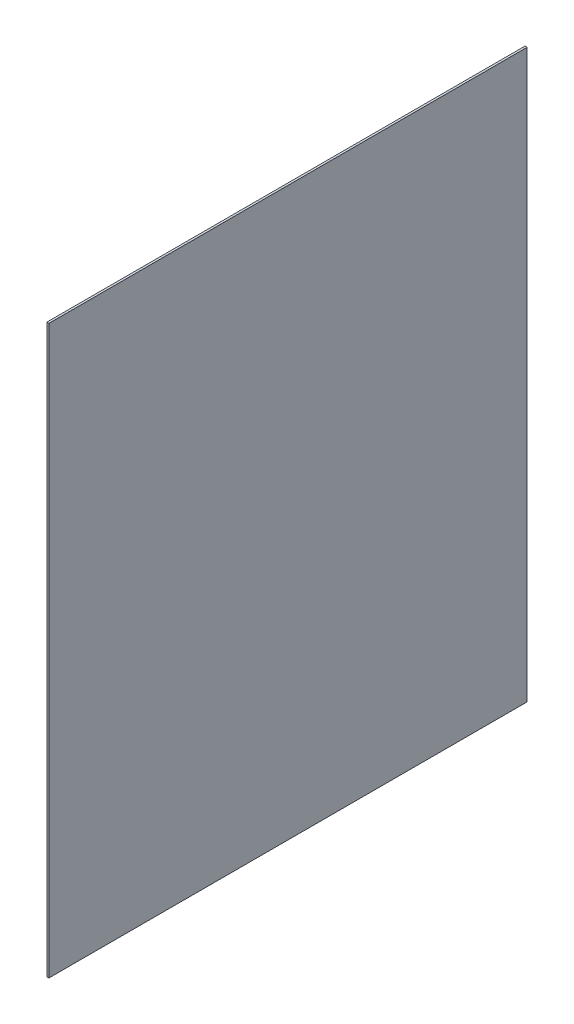
ISO-10303-21;
HEADER;
FILE_DESCRIPTION(('STEP AP214'),'2;1');
FILE_NAME('part.step','',(''),(''),'','','');
FILE_SCHEMA(('AUTOMOTIVE_DESIGN { 1 0 10303 214 1 1 1 1 }'));
ENDSEC;
DATA;
#1=APPLICATION_CONTEXT('core data for automotive mechanical design processes');
#2=APPLICATION_PROTOCOL_DEFINITION('international standard','automotive_design',2000,#1);
#3=PRODUCT_CONTEXT('',#1,'mechanical');
#4=PRODUCT('Part','Part','',(#3));
#5=PRODUCT_RELATED_PRODUCT_CATEGORY('part','',(#4));
#6=PRODUCT_DEFINITION_FORMATION('','',#4);
#7=PRODUCT_DEFINITION_CONTEXT('part definition',#1,'design');
#8=PRODUCT_DEFINITION('design','',#6,#7);
#9=PRODUCT_DEFINITION_SHAPE('','',#8);
#10=(LENGTH_UNIT() NAMED_UNIT(*) SI_UNIT(.MILLI.,.METRE.));
#11=(NAMED_UNIT(*) PLANE_ANGLE_UNIT() SI_UNIT($,.RADIAN.));
#12=(NAMED_UNIT(*) SI_UNIT($,.STERADIAN.) SOLID_ANGLE_UNIT());
#13=UNCERTAINTY_MEASURE_WITH_UNIT(LENGTH_MEASURE(1.E-05),#10,'distance_accuracy_value','');
#14=(GEOMETRIC_REPRESENTATION_CONTEXT(3) GLOBAL_UNCERTAINTY_ASSIGNED_CONTEXT((#13)) GLOBAL_UNIT_ASSIGNED_CONTEXT((#10,
#11,#12)) REPRESENTATION_CONTEXT('',''));
#15=CARTESIAN_POINT('',(0.,0.,0.));
#16=DIRECTION('',(0.,0.,1.));
#17=DIRECTION('',(1.,0.,0.));
#18=AXIS2_PLACEMENT_3D('',#15,#16,#17);
#19=CARTESIAN_POINT('',(-458.3,0.,0.));
#20=DIRECTION('',(-1.,0.,0.));
#21=DIRECTION('',(0.,0.,1.));
#22=AXIS2_PLACEMENT_3D('',#19,#20,#21);
#23=PLANE('',#22);
#24=DIRECTION('',(0.,1.,0.));
#25=VECTOR('',#24,1.);
#26=CARTESIAN_POINT('',(-458.3,100.,387.5));
#27=LINE('',#26,#25);
#28=CARTESIAN_POINT('',(-458.3,500.,387.5));
#29=VERTEX_POINT('',#28);
#30=CARTESIAN_POINT('',(-458.3,100.,387.5));
#31=VERTEX_POINT('',#30);
#32=EDGE_CURVE('E19',#29,#31,#27,.F.);
#33=ORIENTED_EDGE('',*,*,#32,.F.);
#34=DIRECTION('',(0.,0.,1.));
#35=VECTOR('',#34,1.);
#36=CARTESIAN_POINT('',(-458.3,500.,387.5));
#37=LINE('',#36,#35);
#38=CARTESIAN_POINT('',(-458.3,500.,50.));
#39=VERTEX_POINT('',#38);
#40=EDGE_CURVE('E57',#39,#29,#37,.T.);
#41=ORIENTED_EDGE('',*,*,#40,.F.);
#42=DIRECTION('',(0.,1.,0.));
#43=VECTOR('',#42,1.);
#44=CARTESIAN_POINT('',(-458.3,500.,50.));
#45=LINE('',#44,#43);
#46=CARTESIAN_POINT('',(-458.3,100.,50.));
#47=VERTEX_POINT('',#46);
#48=EDGE_CURVE('E52',#47,#39,#45,.T.);
#49=ORIENTED_EDGE('',*,*,#48,.F.);
#50=DIRECTION('',(0.,0.,-1.));
#51=VECTOR('',#50,1.);
#52=CARTESIAN_POINT('',(-458.3,100.,50.));
#53=LINE('',#52,#51);
#54=EDGE_CURVE('E67',#31,#47,#53,.T.);
#55=ORIENTED_EDGE('',*,*,#54,.F.);
#56=EDGE_LOOP('',(#33,#41,#49,#55));
#57=FACE_BOUND('',#56,.T.);
#58=ADVANCED_FACE('F16',(#57),#23,.T.);
#59=CARTESIAN_POINT('',(-456.8,100.,387.5));
#60=DIRECTION('',(0.,0.,1.));
#61=DIRECTION('',(1.,0.,0.));
#62=AXIS2_PLACEMENT_3D('',#59,#60,#61);
#63=PLANE('',#62);
#64=ORIENTED_EDGE('',*,*,#32,.T.);
#65=DIRECTION('',(1.,0.,0.));
#66=VECTOR('',#65,1.);
#67=CARTESIAN_POINT('',(-456.8,100.,387.5));
#68=LINE('',#67,#66);
#69=CARTESIAN_POINT('',(-456.8,100.,387.5));
#70=VERTEX_POINT('',#69);
#71=EDGE_CURVE('E78',#70,#31,#68,.F.);
#72=ORIENTED_EDGE('',*,*,#71,.F.);
#73=DIRECTION('',(0.,1.,0.));
#74=VECTOR('',#73,1.);
#75=CARTESIAN_POINT('',(-456.8,0.,387.5));
#76=LINE('',#75,#74);
#77=CARTESIAN_POINT('',(-456.8,500.,387.5));
#78=VERTEX_POINT('',#77);
#79=EDGE_CURVE('E73',#70,#78,#76,.T.);
#80=ORIENTED_EDGE('',*,*,#79,.T.);
#81=DIRECTION('',(1.,0.,0.));
#82=VECTOR('',#81,1.);
#83=CARTESIAN_POINT('',(-456.8,500.,387.5));
#84=LINE('',#83,#82);
#85=EDGE_CURVE('E62',#29,#78,#84,.T.);
#86=ORIENTED_EDGE('',*,*,#85,.F.);
#87=EDGE_LOOP('',(#64,#72,#80,#86));
#88=FACE_BOUND('',#87,.T.);
#89=ADVANCED_FACE('F72',(#88),#63,.T.);
#90=CARTESIAN_POINT('',(-456.8,500.,387.5));
#91=DIRECTION('',(0.,1.,0.));
#92=DIRECTION('',(0.,0.,1.));
#93=AXIS2_PLACEMENT_3D('',#90,#91,#92);
#94=PLANE('',#93);
#95=ORIENTED_EDGE('',*,*,#40,.T.);
#96=ORIENTED_EDGE('',*,*,#85,.T.);
#97=DIRECTION('',(0.,0.,1.));
#98=VECTOR('',#97,1.);
#99=CARTESIAN_POINT('',(-456.8,500.,0.));
#100=LINE('',#99,#98);
#101=CARTESIAN_POINT('',(-456.8,500.,50.));
#102=VERTEX_POINT('',#101);
#103=EDGE_CURVE('E83',#78,#102,#100,.F.);
#104=ORIENTED_EDGE('',*,*,#103,.T.);
#105=DIRECTION('',(1.,0.,0.));
#106=VECTOR('',#105,1.);
#107=CARTESIAN_POINT('',(-456.8,500.,50.));
#108=LINE('',#107,#106);
#109=EDGE_CURVE('E64',#39,#102,#108,.T.);
#110=ORIENTED_EDGE('',*,*,#109,.F.);
#111=EDGE_LOOP('',(#95,#96,#104,#110));
#112=FACE_BOUND('',#111,.T.);
#113=ADVANCED_FACE('F59',(#112),#94,.T.);
#114=CARTESIAN_POINT('',(-456.8,500.,50.));
#115=DIRECTION('',(0.,0.,-1.));
#116=DIRECTION('',(0.,1.,0.));
#117=AXIS2_PLACEMENT_3D('',#114,#115,#116);
#118=PLANE('',#117);
#119=ORIENTED_EDGE('',*,*,#48,.T.);
#120=ORIENTED_EDGE('',*,*,#109,.T.);
#121=DIRECTION('',(0.,1.,0.));
#122=VECTOR('',#121,1.);
#123=CARTESIAN_POINT('',(-456.8,0.,50.));
#124=LINE('',#123,#122);
#125=CARTESIAN_POINT('',(-456.8,100.,50.));
#126=VERTEX_POINT('',#125);
#127=EDGE_CURVE('E25',#102,#126,#124,.F.);
#128=ORIENTED_EDGE('',*,*,#127,.T.);
#129=DIRECTION('',(1.,0.,0.));
#130=VECTOR('',#129,1.);
#131=CARTESIAN_POINT('',(-456.8,100.,50.));
#132=LINE('',#131,#130);
#133=EDGE_CURVE('E33',#47,#126,#132,.T.);
#134=ORIENTED_EDGE('',*,*,#133,.F.);
#135=EDGE_LOOP('',(#119,#120,#128,#134));
#136=FACE_BOUND('',#135,.T.);
#137=ADVANCED_FACE('F87',(#136),#118,.T.);
#138=CARTESIAN_POINT('',(-456.8,100.,50.));
#139=DIRECTION('',(0.,-1.,0.));
#140=DIRECTION('',(0.,0.,-1.));
#141=AXIS2_PLACEMENT_3D('',#138,#139,#140);
#142=PLANE('',#141);
#143=ORIENTED_EDGE('',*,*,#54,.T.);
#144=ORIENTED_EDGE('',*,*,#133,.T.);
#145=DIRECTION('',(0.,0.,1.));
#146=VECTOR('',#145,1.);
#147=CARTESIAN_POINT('',(-456.8,100.,0.));
#148=LINE('',#147,#146);
#149=EDGE_CURVE('E11',#126,#70,#148,.T.);
#150=ORIENTED_EDGE('',*,*,#149,.T.);
#151=ORIENTED_EDGE('',*,*,#71,.T.);
#152=EDGE_LOOP('',(#143,#144,#150,#151));
#153=FACE_BOUND('',#152,.T.);
#154=ADVANCED_FACE('F90',(#153),#142,.T.);
#155=CARTESIAN_POINT('',(-456.8,0.,0.));
#156=DIRECTION('',(-1.,0.,0.));
#157=DIRECTION('',(0.,0.,1.));
#158=AXIS2_PLACEMENT_3D('',#155,#156,#157);
#159=PLANE('',#158);
#160=ORIENTED_EDGE('',*,*,#127,.F.);
#161=ORIENTED_EDGE('',*,*,#103,.F.);
#162=ORIENTED_EDGE('',*,*,#79,.F.);
#163=ORIENTED_EDGE('',*,*,#149,.F.);
#164=EDGE_LOOP('',(#160,#161,#162,#163));
#165=FACE_BOUND('',#164,.T.);
#166=ADVANCED_FACE('F89',(#165),#159,.F.);
#167=CLOSED_SHELL('',(#58,#89,#113,#137,#154,#166));
#168=MANIFOLD_SOLID_BREP('B1',#167);
#169=ADVANCED_BREP_SHAPE_REPRESENTATION('',(#18,#168),#14);
#170=SHAPE_DEFINITION_REPRESENTATION(#9,#169);
ENDSEC;
END-ISO-10303-21;
